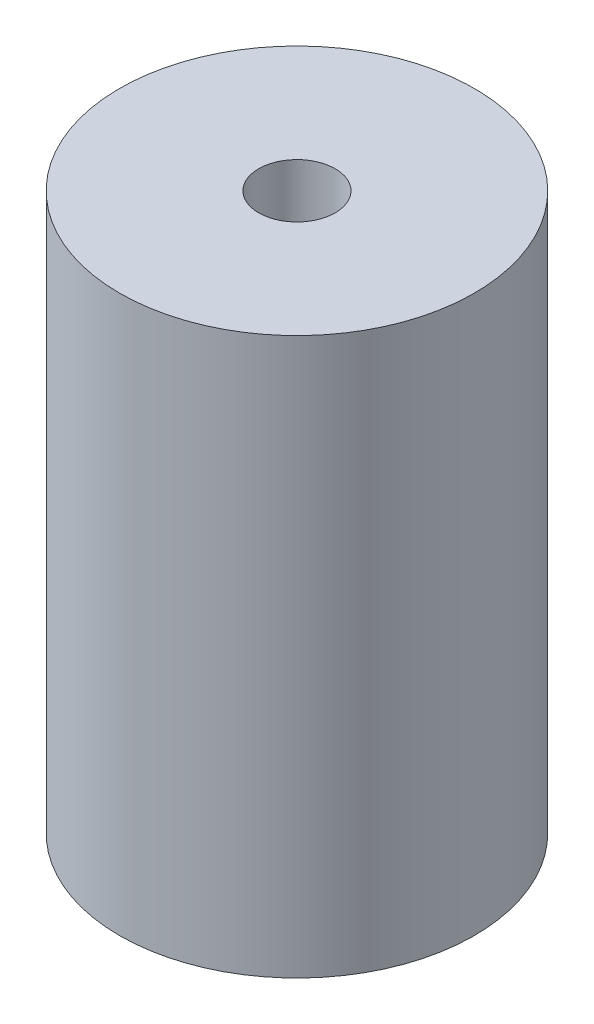
ISO-10303-21;
HEADER;
FILE_DESCRIPTION(('STEP AP214'),'2;1');
FILE_NAME('part.step','',(''),(''),'','','');
FILE_SCHEMA(('AUTOMOTIVE_DESIGN { 1 0 10303 214 1 1 1 1 }'));
ENDSEC;
DATA;
#1=APPLICATION_CONTEXT('core data for automotive mechanical design processes');
#2=APPLICATION_PROTOCOL_DEFINITION('international standard','automotive_design',2000,#1);
#3=PRODUCT_CONTEXT('',#1,'mechanical');
#4=PRODUCT('Part','Part','',(#3));
#5=PRODUCT_RELATED_PRODUCT_CATEGORY('part','',(#4));
#6=PRODUCT_DEFINITION_FORMATION('','',#4);
#7=PRODUCT_DEFINITION_CONTEXT('part definition',#1,'design');
#8=PRODUCT_DEFINITION('design','',#6,#7);
#9=PRODUCT_DEFINITION_SHAPE('','',#8);
#10=(LENGTH_UNIT() NAMED_UNIT(*) SI_UNIT(.MILLI.,.METRE.));
#11=(NAMED_UNIT(*) PLANE_ANGLE_UNIT() SI_UNIT($,.RADIAN.));
#12=(NAMED_UNIT(*) SI_UNIT($,.STERADIAN.) SOLID_ANGLE_UNIT());
#13=UNCERTAINTY_MEASURE_WITH_UNIT(LENGTH_MEASURE(1.E-05),#10,'distance_accuracy_value','');
#14=(GEOMETRIC_REPRESENTATION_CONTEXT(3) GLOBAL_UNCERTAINTY_ASSIGNED_CONTEXT((#13)) GLOBAL_UNIT_ASSIGNED_CONTEXT((#10,
#11,#12)) REPRESENTATION_CONTEXT('',''));
#15=CARTESIAN_POINT('',(0.,0.,0.));
#16=DIRECTION('',(0.,0.,1.));
#17=DIRECTION('',(1.,0.,0.));
#18=AXIS2_PLACEMENT_3D('',#15,#16,#17);
#19=CARTESIAN_POINT('',(0.,80.,0.));
#20=DIRECTION('',(0.,1.,0.));
#21=DIRECTION('',(0.,0.,1.));
#22=AXIS2_PLACEMENT_3D('',#19,#20,#21);
#23=PLANE('',#22);
#24=CARTESIAN_POINT('',(0.,80.,0.));
#25=DIRECTION('',(0.,1.,0.));
#26=DIRECTION('',(0.,0.,1.));
#27=AXIS2_PLACEMENT_3D('',#24,#25,#26);
#28=CIRCLE('',#27,25.5);
#29=CARTESIAN_POINT('',(0.,80.,25.5));
#30=VERTEX_POINT('',#29);
#31=EDGE_CURVE('E10',#30,#30,#28,.T.);
#32=ORIENTED_EDGE('',*,*,#31,.T.);
#33=EDGE_LOOP('',(#32));
#34=FACE_BOUND('',#33,.T.);
#35=CARTESIAN_POINT('',(0.,80.,0.));
#36=DIRECTION('',(0.,1.,0.));
#37=DIRECTION('',(0.,0.,1.));
#38=AXIS2_PLACEMENT_3D('',#35,#36,#37);
#39=CIRCLE('',#38,5.5);
#40=CARTESIAN_POINT('',(0.,80.,5.5));
#41=VERTEX_POINT('',#40);
#42=EDGE_CURVE('E40',#41,#41,#39,.T.);
#43=ORIENTED_EDGE('',*,*,#42,.F.);
#44=EDGE_LOOP('',(#43));
#45=FACE_BOUND('',#44,.T.);
#46=ADVANCED_FACE('F29',(#34,#45),#23,.T.);
#47=CARTESIAN_POINT('',(0.,0.,0.));
#48=DIRECTION('',(0.,1.,0.));
#49=DIRECTION('',(0.,0.,1.));
#50=AXIS2_PLACEMENT_3D('',#47,#48,#49);
#51=PLANE('',#50);
#52=CARTESIAN_POINT('',(0.,0.,0.));
#53=DIRECTION('',(0.,1.,0.));
#54=DIRECTION('',(0.,0.,1.));
#55=AXIS2_PLACEMENT_3D('',#52,#53,#54);
#56=CIRCLE('',#55,25.5);
#57=CARTESIAN_POINT('',(0.,0.,25.5));
#58=VERTEX_POINT('',#57);
#59=EDGE_CURVE('E33',#58,#58,#56,.T.);
#60=ORIENTED_EDGE('',*,*,#59,.F.);
#61=EDGE_LOOP('',(#60));
#62=FACE_BOUND('',#61,.T.);
#63=CARTESIAN_POINT('',(0.,0.,0.));
#64=DIRECTION('',(0.,1.,0.));
#65=DIRECTION('',(0.,0.,1.));
#66=AXIS2_PLACEMENT_3D('',#63,#64,#65);
#67=CIRCLE('',#66,5.5);
#68=CARTESIAN_POINT('',(0.,0.,5.5));
#69=VERTEX_POINT('',#68);
#70=EDGE_CURVE('E42',#69,#69,#67,.T.);
#71=ORIENTED_EDGE('',*,*,#70,.T.);
#72=EDGE_LOOP('',(#71));
#73=FACE_BOUND('',#72,.T.);
#74=ADVANCED_FACE('F52',(#62,#73),#51,.F.);
#75=CARTESIAN_POINT('',(0.,80.,0.));
#76=DIRECTION('',(0.,-1.,0.));
#77=DIRECTION('',(0.,0.,-1.));
#78=AXIS2_PLACEMENT_3D('',#75,#76,#77);
#79=CYLINDRICAL_SURFACE('',#78,25.5);
#80=ORIENTED_EDGE('',*,*,#31,.F.);
#81=EDGE_LOOP('',(#80));
#82=FACE_BOUND('',#81,.T.);
#83=ORIENTED_EDGE('',*,*,#59,.T.);
#84=EDGE_LOOP('',(#83));
#85=FACE_BOUND('',#84,.T.);
#86=ADVANCED_FACE('F31',(#82,#85),#79,.T.);
#87=CARTESIAN_POINT('',(0.,80.,0.));
#88=DIRECTION('',(0.,-1.,0.));
#89=DIRECTION('',(0.,0.,-1.));
#90=AXIS2_PLACEMENT_3D('',#87,#88,#89);
#91=CYLINDRICAL_SURFACE('',#90,5.5);
#92=ORIENTED_EDGE('',*,*,#42,.T.);
#93=EDGE_LOOP('',(#92));
#94=FACE_BOUND('',#93,.T.);
#95=ORIENTED_EDGE('',*,*,#70,.F.);
#96=EDGE_LOOP('',(#95));
#97=FACE_BOUND('',#96,.T.);
#98=ADVANCED_FACE('F48',(#94,#97),#91,.F.);
#99=CLOSED_SHELL('',(#46,#74,#86,#98));
#100=MANIFOLD_SOLID_BREP('B2',#99);
#101=ADVANCED_BREP_SHAPE_REPRESENTATION('',(#18,#100),#14);
#102=SHAPE_DEFINITION_REPRESENTATION(#9,#101);
ENDSEC;
END-ISO-10303-21;
